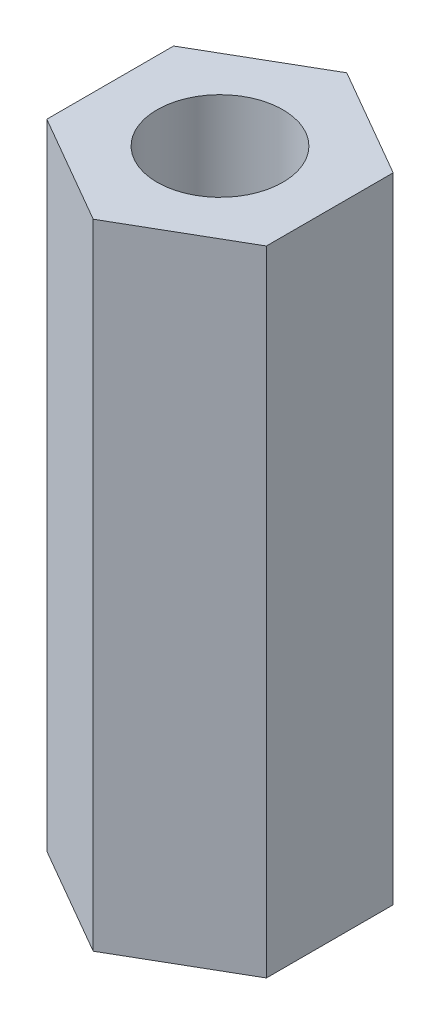
ISO-10303-21;
HEADER;
FILE_DESCRIPTION(('STEP AP214'),'2;1');
FILE_NAME('part.step','',(''),(''),'','','');
FILE_SCHEMA(('AUTOMOTIVE_DESIGN { 1 0 10303 214 1 1 1 1 }'));
ENDSEC;
DATA;
#1=APPLICATION_CONTEXT('core data for automotive mechanical design processes');
#2=APPLICATION_PROTOCOL_DEFINITION('international standard','automotive_design',2000,#1);
#3=PRODUCT_CONTEXT('',#1,'mechanical');
#4=PRODUCT('Part','Part','',(#3));
#5=PRODUCT_RELATED_PRODUCT_CATEGORY('part','',(#4));
#6=PRODUCT_DEFINITION_FORMATION('','',#4);
#7=PRODUCT_DEFINITION_CONTEXT('part definition',#1,'design');
#8=PRODUCT_DEFINITION('design','',#6,#7);
#9=PRODUCT_DEFINITION_SHAPE('','',#8);
#10=(LENGTH_UNIT() NAMED_UNIT(*) SI_UNIT(.MILLI.,.METRE.));
#11=(NAMED_UNIT(*) PLANE_ANGLE_UNIT() SI_UNIT($,.RADIAN.));
#12=(NAMED_UNIT(*) SI_UNIT($,.STERADIAN.) SOLID_ANGLE_UNIT());
#13=UNCERTAINTY_MEASURE_WITH_UNIT(LENGTH_MEASURE(1.E-05),#10,'distance_accuracy_value','');
#14=(GEOMETRIC_REPRESENTATION_CONTEXT(3) GLOBAL_UNCERTAINTY_ASSIGNED_CONTEXT((#13)) GLOBAL_UNIT_ASSIGNED_CONTEXT((#10,
#11,#12)) REPRESENTATION_CONTEXT('',''));
#15=CARTESIAN_POINT('',(0.,0.,0.));
#16=DIRECTION('',(0.,0.,1.));
#17=DIRECTION('',(1.,0.,0.));
#18=AXIS2_PLACEMENT_3D('',#15,#16,#17);
#19=CARTESIAN_POINT('',(0.,80.,0.));
#20=DIRECTION('',(0.,1.,0.));
#21=DIRECTION('',(0.,0.,1.));
#22=AXIS2_PLACEMENT_3D('',#19,#20,#21);
#23=PLANE('',#22);
#24=DIRECTION('',(-0.866025403784439,0.,-0.5));
#25=VECTOR('',#24,1.);
#26=CARTESIAN_POINT('',(13.856406460551,80.,-8.00000000000001));
#27=LINE('',#26,#25);
#28=CARTESIAN_POINT('',(13.856406460551,80.,-8.00000000000001));
#29=VERTEX_POINT('',#28);
#30=CARTESIAN_POINT('',(0.,80.,-16.));
#31=VERTEX_POINT('',#30);
#32=EDGE_CURVE('E129',#29,#31,#27,.T.);
#33=ORIENTED_EDGE('',*,*,#32,.T.);
#34=DIRECTION('',(-0.866025403784438,0.,0.5));
#35=VECTOR('',#34,1.);
#36=CARTESIAN_POINT('',(0.,80.,-16.));
#37=LINE('',#36,#35);
#38=CARTESIAN_POINT('',(-13.856406460551,80.,-8.));
#39=VERTEX_POINT('',#38);
#40=EDGE_CURVE('E87',#31,#39,#37,.T.);
#41=ORIENTED_EDGE('',*,*,#40,.T.);
#42=DIRECTION('',(0.,0.,1.));
#43=VECTOR('',#42,1.);
#44=CARTESIAN_POINT('',(-13.856406460551,80.,-8.));
#45=LINE('',#44,#43);
#46=CARTESIAN_POINT('',(-13.856406460551,80.,8.));
#47=VERTEX_POINT('',#46);
#48=EDGE_CURVE('E100',#39,#47,#45,.T.);
#49=ORIENTED_EDGE('',*,*,#48,.T.);
#50=DIRECTION('',(0.866025403784439,0.,0.5));
#51=VECTOR('',#50,1.);
#52=CARTESIAN_POINT('',(-13.856406460551,80.,8.));
#53=LINE('',#52,#51);
#54=CARTESIAN_POINT('',(0.,80.,16.));
#55=VERTEX_POINT('',#54);
#56=EDGE_CURVE('E94',#47,#55,#53,.T.);
#57=ORIENTED_EDGE('',*,*,#56,.T.);
#58=DIRECTION('',(0.866025403784439,0.,-0.5));
#59=VECTOR('',#58,1.);
#60=CARTESIAN_POINT('',(0.,80.,16.));
#61=LINE('',#60,#59);
#62=CARTESIAN_POINT('',(13.856406460551,80.,8.));
#63=VERTEX_POINT('',#62);
#64=EDGE_CURVE('E98',#55,#63,#61,.T.);
#65=ORIENTED_EDGE('',*,*,#64,.T.);
#66=DIRECTION('',(0.,0.,-1.));
#67=VECTOR('',#66,1.);
#68=CARTESIAN_POINT('',(13.856406460551,80.,8.));
#69=LINE('',#68,#67);
#70=EDGE_CURVE('E50',#63,#29,#69,.T.);
#71=ORIENTED_EDGE('',*,*,#70,.T.);
#72=EDGE_LOOP('',(#33,#41,#49,#57,#65,#71));
#73=FACE_BOUND('',#72,.T.);
#74=CARTESIAN_POINT('',(0.,80.,0.));
#75=DIRECTION('',(0.,1.,0.));
#76=DIRECTION('',(0.,0.,1.));
#77=AXIS2_PLACEMENT_3D('',#74,#75,#76);
#78=CIRCLE('',#77,7.9375);
#79=CARTESIAN_POINT('',(0.,80.,7.9375));
#80=VERTEX_POINT('',#79);
#81=EDGE_CURVE('E122',#80,#80,#78,.T.);
#82=ORIENTED_EDGE('',*,*,#81,.F.);
#83=EDGE_LOOP('',(#82));
#84=FACE_BOUND('',#83,.T.);
#85=ADVANCED_FACE('F33',(#73,#84),#23,.T.);
#86=CARTESIAN_POINT('',(0.,0.,0.));
#87=DIRECTION('',(0.,1.,0.));
#88=DIRECTION('',(0.,0.,1.));
#89=AXIS2_PLACEMENT_3D('',#86,#87,#88);
#90=PLANE('',#89);
#91=DIRECTION('',(-0.866025403784439,0.,-0.5));
#92=VECTOR('',#91,1.);
#93=CARTESIAN_POINT('',(13.856406460551,0.,-8.00000000000001));
#94=LINE('',#93,#92);
#95=CARTESIAN_POINT('',(13.856406460551,0.,-8.00000000000001));
#96=VERTEX_POINT('',#95);
#97=CARTESIAN_POINT('',(0.,0.,-16.));
#98=VERTEX_POINT('',#97);
#99=EDGE_CURVE('E118',#96,#98,#94,.T.);
#100=ORIENTED_EDGE('',*,*,#99,.F.);
#101=DIRECTION('',(0.,0.,-1.));
#102=VECTOR('',#101,1.);
#103=CARTESIAN_POINT('',(13.856406460551,0.,8.));
#104=LINE('',#103,#102);
#105=CARTESIAN_POINT('',(13.856406460551,0.,8.));
#106=VERTEX_POINT('',#105);
#107=EDGE_CURVE('E79',#106,#96,#104,.T.);
#108=ORIENTED_EDGE('',*,*,#107,.F.);
#109=DIRECTION('',(0.866025403784439,0.,-0.5));
#110=VECTOR('',#109,1.);
#111=CARTESIAN_POINT('',(0.,0.,16.));
#112=LINE('',#111,#110);
#113=CARTESIAN_POINT('',(0.,0.,16.));
#114=VERTEX_POINT('',#113);
#115=EDGE_CURVE('E73',#114,#106,#112,.T.);
#116=ORIENTED_EDGE('',*,*,#115,.F.);
#117=DIRECTION('',(0.866025403784439,0.,0.5));
#118=VECTOR('',#117,1.);
#119=CARTESIAN_POINT('',(-13.856406460551,0.,8.));
#120=LINE('',#119,#118);
#121=CARTESIAN_POINT('',(-13.856406460551,0.,8.));
#122=VERTEX_POINT('',#121);
#123=EDGE_CURVE('E108',#122,#114,#120,.T.);
#124=ORIENTED_EDGE('',*,*,#123,.F.);
#125=DIRECTION('',(0.,0.,1.));
#126=VECTOR('',#125,1.);
#127=CARTESIAN_POINT('',(-13.856406460551,0.,-8.));
#128=LINE('',#127,#126);
#129=CARTESIAN_POINT('',(-13.856406460551,0.,-8.));
#130=VERTEX_POINT('',#129);
#131=EDGE_CURVE('E124',#130,#122,#128,.T.);
#132=ORIENTED_EDGE('',*,*,#131,.F.);
#133=DIRECTION('',(-0.866025403784438,0.,0.5));
#134=VECTOR('',#133,1.);
#135=CARTESIAN_POINT('',(0.,0.,-16.));
#136=LINE('',#135,#134);
#137=EDGE_CURVE('E121',#98,#130,#136,.T.);
#138=ORIENTED_EDGE('',*,*,#137,.F.);
#139=EDGE_LOOP('',(#100,#108,#116,#124,#132,#138));
#140=FACE_BOUND('',#139,.T.);
#141=CARTESIAN_POINT('',(0.,0.,0.));
#142=DIRECTION('',(0.,1.,0.));
#143=DIRECTION('',(0.,0.,1.));
#144=AXIS2_PLACEMENT_3D('',#141,#142,#143);
#145=CIRCLE('',#144,7.9375);
#146=CARTESIAN_POINT('',(0.,0.,7.9375));
#147=VERTEX_POINT('',#146);
#148=EDGE_CURVE('E222',#147,#147,#145,.T.);
#149=ORIENTED_EDGE('',*,*,#148,.T.);
#150=EDGE_LOOP('',(#149));
#151=FACE_BOUND('',#150,.T.);
#152=ADVANCED_FACE('F138',(#140,#151),#90,.F.);
#153=CARTESIAN_POINT('',(13.856406460551,80.,-8.00000000000001));
#154=DIRECTION('',(-0.5,0.,0.866025403784439));
#155=DIRECTION('',(0.866025403784439,0.,0.5));
#156=AXIS2_PLACEMENT_3D('',#153,#154,#155);
#157=PLANE('',#156);
#158=ORIENTED_EDGE('',*,*,#99,.T.);
#159=DIRECTION('',(0.,-1.,0.));
#160=VECTOR('',#159,1.);
#161=CARTESIAN_POINT('',(0.,80.,-16.));
#162=LINE('',#161,#160);
#163=EDGE_CURVE('E11',#31,#98,#162,.T.);
#164=ORIENTED_EDGE('',*,*,#163,.F.);
#165=ORIENTED_EDGE('',*,*,#32,.F.);
#166=DIRECTION('',(0.,-1.,0.));
#167=VECTOR('',#166,1.);
#168=CARTESIAN_POINT('',(13.856406460551,80.,-8.00000000000001));
#169=LINE('',#168,#167);
#170=EDGE_CURVE('E114',#29,#96,#169,.T.);
#171=ORIENTED_EDGE('',*,*,#170,.T.);
#172=EDGE_LOOP('',(#158,#164,#165,#171));
#173=FACE_BOUND('',#172,.T.);
#174=ADVANCED_FACE('F35',(#173),#157,.F.);
#175=CARTESIAN_POINT('',(0.,80.,-16.));
#176=DIRECTION('',(0.5,0.,0.866025403784438));
#177=DIRECTION('',(0.866025403784438,0.,-0.5));
#178=AXIS2_PLACEMENT_3D('',#175,#176,#177);
#179=PLANE('',#178);
#180=ORIENTED_EDGE('',*,*,#137,.T.);
#181=DIRECTION('',(0.,-1.,0.));
#182=VECTOR('',#181,1.);
#183=CARTESIAN_POINT('',(-13.856406460551,80.,-8.));
#184=LINE('',#183,#182);
#185=EDGE_CURVE('E42',#39,#130,#184,.T.);
#186=ORIENTED_EDGE('',*,*,#185,.F.);
#187=ORIENTED_EDGE('',*,*,#40,.F.);
#188=ORIENTED_EDGE('',*,*,#163,.T.);
#189=EDGE_LOOP('',(#180,#186,#187,#188));
#190=FACE_BOUND('',#189,.T.);
#191=ADVANCED_FACE('F163',(#190),#179,.F.);
#192=CARTESIAN_POINT('',(-13.856406460551,80.,-8.));
#193=DIRECTION('',(1.,0.,0.));
#194=DIRECTION('',(0.,0.,-1.));
#195=AXIS2_PLACEMENT_3D('',#192,#193,#194);
#196=PLANE('',#195);
#197=ORIENTED_EDGE('',*,*,#131,.T.);
#198=DIRECTION('',(0.,-1.,0.));
#199=VECTOR('',#198,1.);
#200=CARTESIAN_POINT('',(-13.856406460551,80.,8.));
#201=LINE('',#200,#199);
#202=EDGE_CURVE('E109',#47,#122,#201,.T.);
#203=ORIENTED_EDGE('',*,*,#202,.F.);
#204=ORIENTED_EDGE('',*,*,#48,.F.);
#205=ORIENTED_EDGE('',*,*,#185,.T.);
#206=EDGE_LOOP('',(#197,#203,#204,#205));
#207=FACE_BOUND('',#206,.T.);
#208=ADVANCED_FACE('F135',(#207),#196,.F.);
#209=CARTESIAN_POINT('',(-13.856406460551,80.,8.));
#210=DIRECTION('',(0.5,0.,-0.866025403784439));
#211=DIRECTION('',(-0.866025403784439,0.,-0.5));
#212=AXIS2_PLACEMENT_3D('',#209,#210,#211);
#213=PLANE('',#212);
#214=ORIENTED_EDGE('',*,*,#123,.T.);
#215=DIRECTION('',(0.,-1.,0.));
#216=VECTOR('',#215,1.);
#217=CARTESIAN_POINT('',(0.,80.,16.));
#218=LINE('',#217,#216);
#219=EDGE_CURVE('E105',#55,#114,#218,.T.);
#220=ORIENTED_EDGE('',*,*,#219,.F.);
#221=ORIENTED_EDGE('',*,*,#56,.F.);
#222=ORIENTED_EDGE('',*,*,#202,.T.);
#223=EDGE_LOOP('',(#214,#220,#221,#222));
#224=FACE_BOUND('',#223,.T.);
#225=ADVANCED_FACE('F106',(#224),#213,.F.);
#226=CARTESIAN_POINT('',(0.,80.,16.));
#227=DIRECTION('',(-0.5,0.,-0.866025403784439));
#228=DIRECTION('',(-0.866025403784439,0.,0.5));
#229=AXIS2_PLACEMENT_3D('',#226,#227,#228);
#230=PLANE('',#229);
#231=ORIENTED_EDGE('',*,*,#115,.T.);
#232=DIRECTION('',(0.,-1.,0.));
#233=VECTOR('',#232,1.);
#234=CARTESIAN_POINT('',(13.856406460551,80.,8.));
#235=LINE('',#234,#233);
#236=EDGE_CURVE('E110',#63,#106,#235,.T.);
#237=ORIENTED_EDGE('',*,*,#236,.F.);
#238=ORIENTED_EDGE('',*,*,#64,.F.);
#239=ORIENTED_EDGE('',*,*,#219,.T.);
#240=EDGE_LOOP('',(#231,#237,#238,#239));
#241=FACE_BOUND('',#240,.T.);
#242=ADVANCED_FACE('F112',(#241),#230,.F.);
#243=CARTESIAN_POINT('',(13.856406460551,80.,8.));
#244=DIRECTION('',(-1.,0.,0.));
#245=DIRECTION('',(0.,0.,1.));
#246=AXIS2_PLACEMENT_3D('',#243,#244,#245);
#247=PLANE('',#246);
#248=ORIENTED_EDGE('',*,*,#107,.T.);
#249=ORIENTED_EDGE('',*,*,#170,.F.);
#250=ORIENTED_EDGE('',*,*,#70,.F.);
#251=ORIENTED_EDGE('',*,*,#236,.T.);
#252=EDGE_LOOP('',(#248,#249,#250,#251));
#253=FACE_BOUND('',#252,.T.);
#254=ADVANCED_FACE('F143',(#253),#247,.F.);
#255=CARTESIAN_POINT('',(0.,80.,0.));
#256=DIRECTION('',(0.,-1.,0.));
#257=DIRECTION('',(0.,0.,-1.));
#258=AXIS2_PLACEMENT_3D('',#255,#256,#257);
#259=CYLINDRICAL_SURFACE('',#258,7.9375);
#260=ORIENTED_EDGE('',*,*,#81,.T.);
#261=EDGE_LOOP('',(#260));
#262=FACE_BOUND('',#261,.T.);
#263=ORIENTED_EDGE('',*,*,#148,.F.);
#264=EDGE_LOOP('',(#263));
#265=FACE_BOUND('',#264,.T.);
#266=ADVANCED_FACE('F145',(#262,#265),#259,.F.);
#267=CLOSED_SHELL('',(#85,#152,#174,#191,#208,#225,#242,#254,#266));
#268=MANIFOLD_SOLID_BREP('B2',#267);
#269=ADVANCED_BREP_SHAPE_REPRESENTATION('',(#18,#268),#14);
#270=SHAPE_DEFINITION_REPRESENTATION(#9,#269);
ENDSEC;
END-ISO-10303-21;
